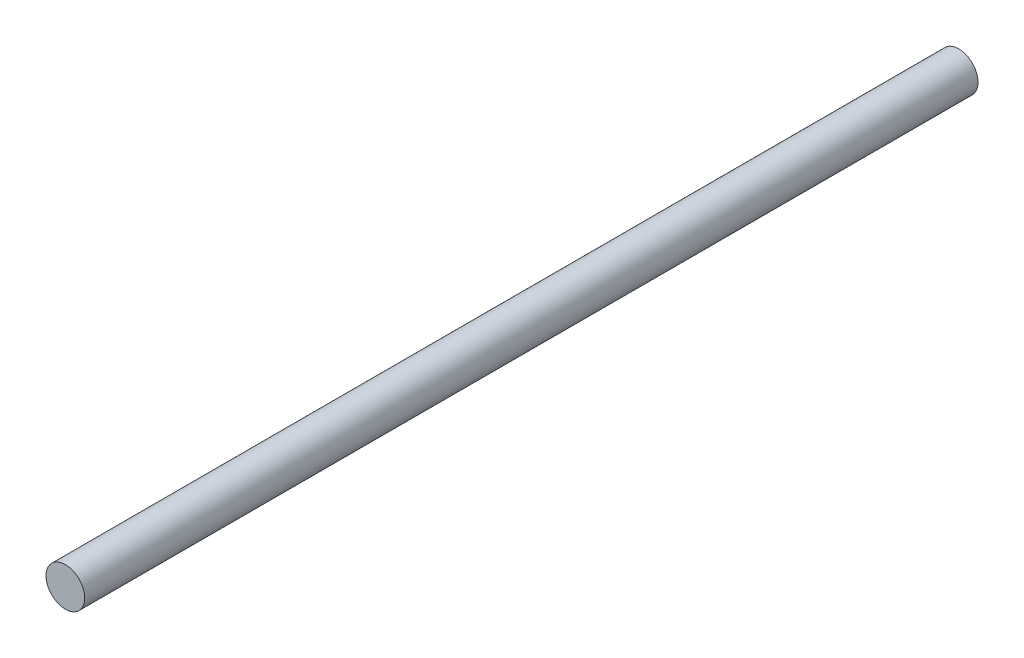
ISO-10303-21;
HEADER;
FILE_DESCRIPTION(('STEP AP214'),'2;1');
FILE_NAME('part.step','',(''),(''),'','','');
FILE_SCHEMA(('AUTOMOTIVE_DESIGN { 1 0 10303 214 1 1 1 1 }'));
ENDSEC;
DATA;
#1=APPLICATION_CONTEXT('core data for automotive mechanical design processes');
#2=APPLICATION_PROTOCOL_DEFINITION('international standard','automotive_design',2000,#1);
#3=PRODUCT_CONTEXT('',#1,'mechanical');
#4=PRODUCT('Part','Part','',(#3));
#5=PRODUCT_RELATED_PRODUCT_CATEGORY('part','',(#4));
#6=PRODUCT_DEFINITION_FORMATION('','',#4);
#7=PRODUCT_DEFINITION_CONTEXT('part definition',#1,'design');
#8=PRODUCT_DEFINITION('design','',#6,#7);
#9=PRODUCT_DEFINITION_SHAPE('','',#8);
#10=(LENGTH_UNIT() NAMED_UNIT(*) SI_UNIT(.MILLI.,.METRE.));
#11=(NAMED_UNIT(*) PLANE_ANGLE_UNIT() SI_UNIT($,.RADIAN.));
#12=(NAMED_UNIT(*) SI_UNIT($,.STERADIAN.) SOLID_ANGLE_UNIT());
#13=UNCERTAINTY_MEASURE_WITH_UNIT(LENGTH_MEASURE(1.E-05),#10,'distance_accuracy_value','');
#14=(GEOMETRIC_REPRESENTATION_CONTEXT(3) GLOBAL_UNCERTAINTY_ASSIGNED_CONTEXT((#13)) GLOBAL_UNIT_ASSIGNED_CONTEXT((#10,
#11,#12)) REPRESENTATION_CONTEXT('',''));
#15=CARTESIAN_POINT('',(0.,0.,0.));
#16=DIRECTION('',(0.,0.,1.));
#17=DIRECTION('',(1.,0.,0.));
#18=AXIS2_PLACEMENT_3D('',#15,#16,#17);
#19=CARTESIAN_POINT('',(0.,0.,180.));
#20=DIRECTION('',(0.,0.,-1.));
#21=DIRECTION('',(-1.,0.,0.));
#22=AXIS2_PLACEMENT_3D('',#19,#20,#21);
#23=CYLINDRICAL_SURFACE('',#22,3.9);
#24=CARTESIAN_POINT('',(0.,0.,180.));
#25=DIRECTION('',(0.,0.,-1.));
#26=DIRECTION('',(-1.,0.,0.));
#27=AXIS2_PLACEMENT_3D('',#24,#25,#26);
#28=CIRCLE('',#27,3.9);
#29=CARTESIAN_POINT('',(-3.9,0.,180.));
#30=VERTEX_POINT('',#29);
#31=EDGE_CURVE('E11',#30,#30,#28,.T.);
#32=ORIENTED_EDGE('',*,*,#31,.T.);
#33=EDGE_LOOP('',(#32));
#34=FACE_BOUND('',#33,.T.);
#35=CARTESIAN_POINT('',(0.,0.,0.));
#36=DIRECTION('',(0.,0.,-1.));
#37=DIRECTION('',(-1.,0.,0.));
#38=AXIS2_PLACEMENT_3D('',#35,#36,#37);
#39=CIRCLE('',#38,3.9);
#40=CARTESIAN_POINT('',(-3.9,0.,0.));
#41=VERTEX_POINT('',#40);
#42=EDGE_CURVE('E45',#41,#41,#39,.T.);
#43=ORIENTED_EDGE('',*,*,#42,.F.);
#44=EDGE_LOOP('',(#43));
#45=FACE_BOUND('',#44,.T.);
#46=ADVANCED_FACE('F38',(#34,#45),#23,.T.);
#47=CARTESIAN_POINT('',(3.9,0.,180.));
#48=DIRECTION('',(0.,0.,1.));
#49=DIRECTION('',(1.,0.,0.));
#50=AXIS2_PLACEMENT_3D('',#47,#48,#49);
#51=PLANE('',#50);
#52=ORIENTED_EDGE('',*,*,#31,.F.);
#53=EDGE_LOOP('',(#52));
#54=FACE_BOUND('',#53,.T.);
#55=ADVANCED_FACE('F56',(#54),#51,.T.);
#56=CARTESIAN_POINT('',(0.,0.,0.));
#57=DIRECTION('',(0.,0.,-1.));
#58=DIRECTION('',(-1.,0.,0.));
#59=AXIS2_PLACEMENT_3D('',#56,#57,#58);
#60=PLANE('',#59);
#61=ORIENTED_EDGE('',*,*,#42,.T.);
#62=EDGE_LOOP('',(#61));
#63=FACE_BOUND('',#62,.T.);
#64=ADVANCED_FACE('F53',(#63),#60,.T.);
#65=CLOSED_SHELL('',(#46,#55,#64));
#66=MANIFOLD_SOLID_BREP('B2',#65);
#67=ADVANCED_BREP_SHAPE_REPRESENTATION('',(#18,#66),#14);
#68=SHAPE_DEFINITION_REPRESENTATION(#9,#67);
ENDSEC;
END-ISO-10303-21;
